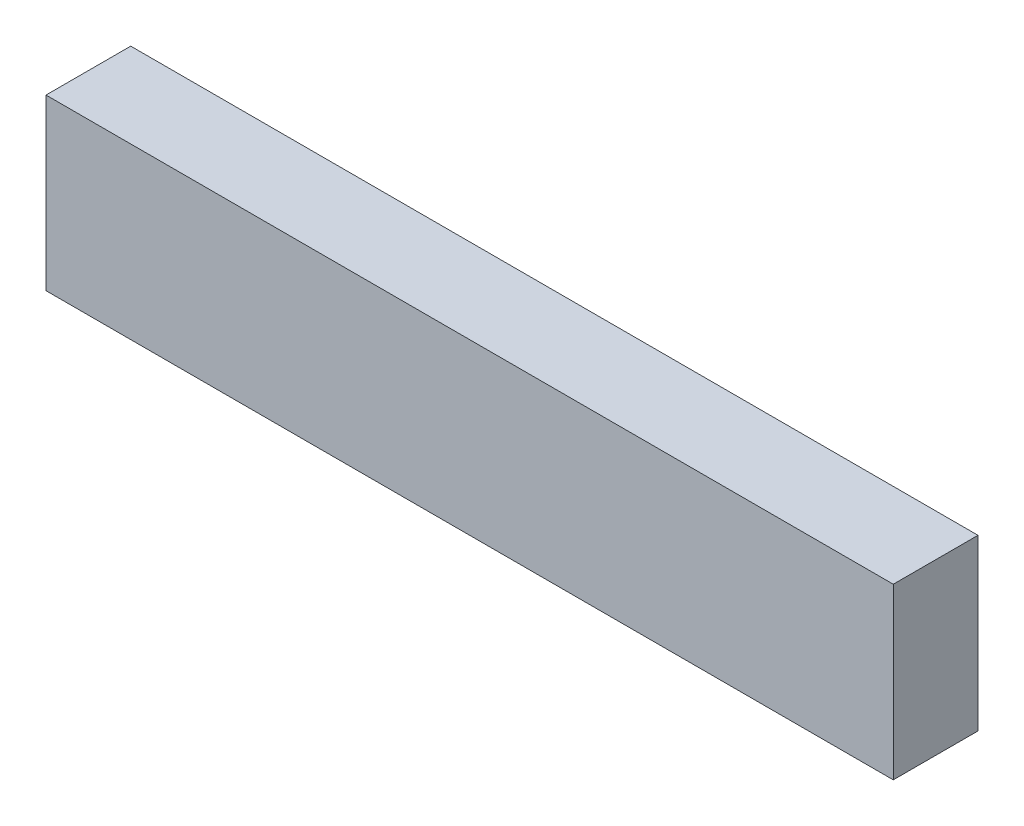
ISO-10303-21;
HEADER;
FILE_DESCRIPTION(('STEP AP214'),'2;1');
FILE_NAME('part.step','',(''),(''),'','','');
FILE_SCHEMA(('AUTOMOTIVE_DESIGN { 1 0 10303 214 1 1 1 1 }'));
ENDSEC;
DATA;
#1=APPLICATION_CONTEXT('core data for automotive mechanical design processes');
#2=APPLICATION_PROTOCOL_DEFINITION('international standard','automotive_design',2000,#1);
#3=PRODUCT_CONTEXT('',#1,'mechanical');
#4=PRODUCT('Part','Part','',(#3));
#5=PRODUCT_RELATED_PRODUCT_CATEGORY('part','',(#4));
#6=PRODUCT_DEFINITION_FORMATION('','',#4);
#7=PRODUCT_DEFINITION_CONTEXT('part definition',#1,'design');
#8=PRODUCT_DEFINITION('design','',#6,#7);
#9=PRODUCT_DEFINITION_SHAPE('','',#8);
#10=(LENGTH_UNIT() NAMED_UNIT(*) SI_UNIT(.MILLI.,.METRE.));
#11=(NAMED_UNIT(*) PLANE_ANGLE_UNIT() SI_UNIT($,.RADIAN.));
#12=(NAMED_UNIT(*) SI_UNIT($,.STERADIAN.) SOLID_ANGLE_UNIT());
#13=UNCERTAINTY_MEASURE_WITH_UNIT(LENGTH_MEASURE(1.E-05),#10,'distance_accuracy_value','');
#14=(GEOMETRIC_REPRESENTATION_CONTEXT(3) GLOBAL_UNCERTAINTY_ASSIGNED_CONTEXT((#13)) GLOBAL_UNIT_ASSIGNED_CONTEXT((#10,
#11,#12)) REPRESENTATION_CONTEXT('',''));
#15=CARTESIAN_POINT('',(0.,0.,0.));
#16=DIRECTION('',(0.,0.,1.));
#17=DIRECTION('',(1.,0.,0.));
#18=AXIS2_PLACEMENT_3D('',#15,#16,#17);
#19=CARTESIAN_POINT('',(100.,-10.,5.));
#20=DIRECTION('',(0.,0.,-1.));
#21=DIRECTION('',(-1.,0.,0.));
#22=AXIS2_PLACEMENT_3D('',#19,#20,#21);
#23=PLANE('',#22);
#24=DIRECTION('',(0.,-1.,0.));
#25=VECTOR('',#24,1.);
#26=CARTESIAN_POINT('',(0.,-10.,5.));
#27=LINE('',#26,#25);
#28=CARTESIAN_POINT('',(0.,10.,5.));
#29=VERTEX_POINT('',#28);
#30=CARTESIAN_POINT('',(0.,-10.,5.));
#31=VERTEX_POINT('',#30);
#32=EDGE_CURVE('E133',#29,#31,#27,.T.);
#33=ORIENTED_EDGE('',*,*,#32,.T.);
#34=DIRECTION('',(-1.,0.,0.));
#35=VECTOR('',#34,1.);
#36=CARTESIAN_POINT('',(100.,-10.,5.));
#37=LINE('',#36,#35);
#38=CARTESIAN_POINT('',(100.,-10.,5.));
#39=VERTEX_POINT('',#38);
#40=EDGE_CURVE('E12',#39,#31,#37,.T.);
#41=ORIENTED_EDGE('',*,*,#40,.F.);
#42=DIRECTION('',(0.,-1.,0.));
#43=VECTOR('',#42,1.);
#44=CARTESIAN_POINT('',(100.,-10.,5.));
#45=LINE('',#44,#43);
#46=CARTESIAN_POINT('',(100.,10.,5.));
#47=VERTEX_POINT('',#46);
#48=EDGE_CURVE('E97',#47,#39,#45,.T.);
#49=ORIENTED_EDGE('',*,*,#48,.F.);
#50=DIRECTION('',(-1.,0.,0.));
#51=VECTOR('',#50,1.);
#52=CARTESIAN_POINT('',(100.,10.,5.));
#53=LINE('',#52,#51);
#54=EDGE_CURVE('E109',#47,#29,#53,.T.);
#55=ORIENTED_EDGE('',*,*,#54,.T.);
#56=EDGE_LOOP('',(#33,#41,#49,#55));
#57=FACE_BOUND('',#56,.T.);
#58=ADVANCED_FACE('F44',(#57),#23,.F.);
#59=CARTESIAN_POINT('',(100.,-10.,-5.));
#60=DIRECTION('',(0.,1.,0.));
#61=DIRECTION('',(0.,0.,1.));
#62=AXIS2_PLACEMENT_3D('',#59,#60,#61);
#63=PLANE('',#62);
#64=DIRECTION('',(0.,0.,-1.));
#65=VECTOR('',#64,1.);
#66=CARTESIAN_POINT('',(0.,-10.,-5.));
#67=LINE('',#66,#65);
#68=CARTESIAN_POINT('',(0.,-10.,-5.));
#69=VERTEX_POINT('',#68);
#70=EDGE_CURVE('E102',#31,#69,#67,.T.);
#71=ORIENTED_EDGE('',*,*,#70,.T.);
#72=DIRECTION('',(-1.,0.,0.));
#73=VECTOR('',#72,1.);
#74=CARTESIAN_POINT('',(100.,-10.,-5.));
#75=LINE('',#74,#73);
#76=CARTESIAN_POINT('',(100.,-10.,-5.));
#77=VERTEX_POINT('',#76);
#78=EDGE_CURVE('E54',#77,#69,#75,.T.);
#79=ORIENTED_EDGE('',*,*,#78,.F.);
#80=DIRECTION('',(0.,0.,-1.));
#81=VECTOR('',#80,1.);
#82=CARTESIAN_POINT('',(100.,-10.,-5.));
#83=LINE('',#82,#81);
#84=EDGE_CURVE('E92',#39,#77,#83,.T.);
#85=ORIENTED_EDGE('',*,*,#84,.F.);
#86=ORIENTED_EDGE('',*,*,#40,.T.);
#87=EDGE_LOOP('',(#71,#79,#85,#86));
#88=FACE_BOUND('',#87,.T.);
#89=ADVANCED_FACE('F101',(#88),#63,.F.);
#90=CARTESIAN_POINT('',(100.,-10.,-5.));
#91=DIRECTION('',(0.,0.,1.));
#92=DIRECTION('',(1.,0.,0.));
#93=AXIS2_PLACEMENT_3D('',#90,#91,#92);
#94=PLANE('',#93);
#95=DIRECTION('',(0.,1.,0.));
#96=VECTOR('',#95,1.);
#97=CARTESIAN_POINT('',(0.,-10.,-5.));
#98=LINE('',#97,#96);
#99=CARTESIAN_POINT('',(0.,10.,-5.));
#100=VERTEX_POINT('',#99);
#101=EDGE_CURVE('E79',#69,#100,#98,.T.);
#102=ORIENTED_EDGE('',*,*,#101,.T.);
#103=DIRECTION('',(-1.,0.,0.));
#104=VECTOR('',#103,1.);
#105=CARTESIAN_POINT('',(100.,10.,-5.));
#106=LINE('',#105,#104);
#107=CARTESIAN_POINT('',(100.,10.,-5.));
#108=VERTEX_POINT('',#107);
#109=EDGE_CURVE('E104',#108,#100,#106,.T.);
#110=ORIENTED_EDGE('',*,*,#109,.F.);
#111=DIRECTION('',(0.,1.,0.));
#112=VECTOR('',#111,1.);
#113=CARTESIAN_POINT('',(100.,-10.,-5.));
#114=LINE('',#113,#112);
#115=EDGE_CURVE('E95',#77,#108,#114,.T.);
#116=ORIENTED_EDGE('',*,*,#115,.F.);
#117=ORIENTED_EDGE('',*,*,#78,.T.);
#118=EDGE_LOOP('',(#102,#110,#116,#117));
#119=FACE_BOUND('',#118,.T.);
#120=ADVANCED_FACE('F105',(#119),#94,.F.);
#121=CARTESIAN_POINT('',(100.,10.,-5.));
#122=DIRECTION('',(0.,-1.,0.));
#123=DIRECTION('',(0.,0.,-1.));
#124=AXIS2_PLACEMENT_3D('',#121,#122,#123);
#125=PLANE('',#124);
#126=DIRECTION('',(0.,0.,1.));
#127=VECTOR('',#126,1.);
#128=CARTESIAN_POINT('',(0.,10.,-5.));
#129=LINE('',#128,#127);
#130=EDGE_CURVE('E85',#100,#29,#129,.T.);
#131=ORIENTED_EDGE('',*,*,#130,.T.);
#132=ORIENTED_EDGE('',*,*,#54,.F.);
#133=DIRECTION('',(0.,0.,1.));
#134=VECTOR('',#133,1.);
#135=CARTESIAN_POINT('',(100.,10.,-5.));
#136=LINE('',#135,#134);
#137=EDGE_CURVE('E62',#108,#47,#136,.T.);
#138=ORIENTED_EDGE('',*,*,#137,.F.);
#139=ORIENTED_EDGE('',*,*,#109,.T.);
#140=EDGE_LOOP('',(#131,#132,#138,#139));
#141=FACE_BOUND('',#140,.T.);
#142=ADVANCED_FACE('F146',(#141),#125,.F.);
#143=CARTESIAN_POINT('',(100.,0.,0.));
#144=DIRECTION('',(1.,0.,0.));
#145=DIRECTION('',(0.,0.,-1.));
#146=AXIS2_PLACEMENT_3D('',#143,#144,#145);
#147=PLANE('',#146);
#148=ORIENTED_EDGE('',*,*,#48,.T.);
#149=ORIENTED_EDGE('',*,*,#84,.T.);
#150=ORIENTED_EDGE('',*,*,#115,.T.);
#151=ORIENTED_EDGE('',*,*,#137,.T.);
#152=EDGE_LOOP('',(#148,#149,#150,#151));
#153=FACE_BOUND('',#152,.T.);
#154=ADVANCED_FACE('F93',(#153),#147,.T.);
#155=CARTESIAN_POINT('',(0.,0.,0.));
#156=DIRECTION('',(1.,0.,0.));
#157=DIRECTION('',(0.,0.,-1.));
#158=AXIS2_PLACEMENT_3D('',#155,#156,#157);
#159=PLANE('',#158);
#160=ORIENTED_EDGE('',*,*,#32,.F.);
#161=ORIENTED_EDGE('',*,*,#130,.F.);
#162=ORIENTED_EDGE('',*,*,#101,.F.);
#163=ORIENTED_EDGE('',*,*,#70,.F.);
#164=EDGE_LOOP('',(#160,#161,#162,#163));
#165=FACE_BOUND('',#164,.T.);
#166=ADVANCED_FACE('F140',(#165),#159,.F.);
#167=CLOSED_SHELL('',(#58,#89,#120,#142,#154,#166));
#168=MANIFOLD_SOLID_BREP('B2',#167);
#169=ADVANCED_BREP_SHAPE_REPRESENTATION('',(#18,#168),#14);
#170=SHAPE_DEFINITION_REPRESENTATION(#9,#169);
ENDSEC;
END-ISO-10303-21;
